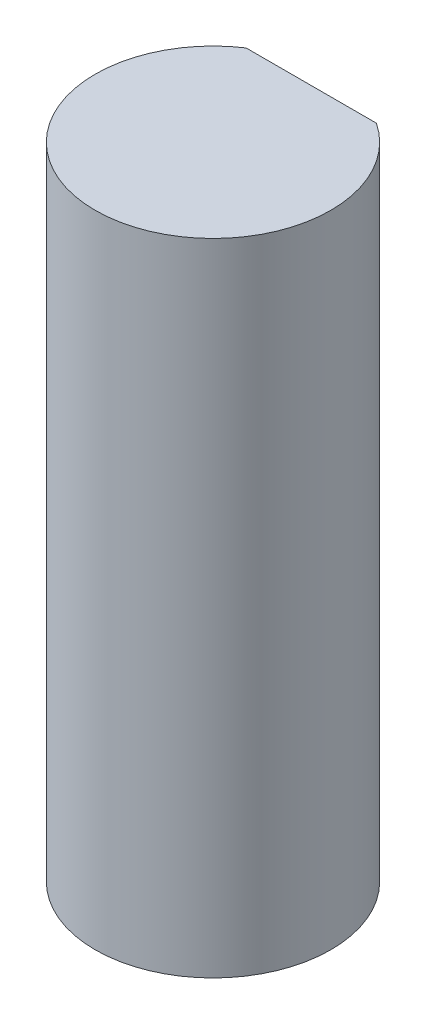
ISO-10303-21;
HEADER;
FILE_DESCRIPTION(('STEP AP214'),'2;1');
FILE_NAME('part.step','',(''),(''),'','','');
FILE_SCHEMA(('AUTOMOTIVE_DESIGN { 1 0 10303 214 1 1 1 1 }'));
ENDSEC;
DATA;
#1=APPLICATION_CONTEXT('core data for automotive mechanical design processes');
#2=APPLICATION_PROTOCOL_DEFINITION('international standard','automotive_design',2000,#1);
#3=PRODUCT_CONTEXT('',#1,'mechanical');
#4=PRODUCT('Part','Part','',(#3));
#5=PRODUCT_RELATED_PRODUCT_CATEGORY('part','',(#4));
#6=PRODUCT_DEFINITION_FORMATION('','',#4);
#7=PRODUCT_DEFINITION_CONTEXT('part definition',#1,'design');
#8=PRODUCT_DEFINITION('design','',#6,#7);
#9=PRODUCT_DEFINITION_SHAPE('','',#8);
#10=(LENGTH_UNIT() NAMED_UNIT(*) SI_UNIT(.MILLI.,.METRE.));
#11=(NAMED_UNIT(*) PLANE_ANGLE_UNIT() SI_UNIT($,.RADIAN.));
#12=(NAMED_UNIT(*) SI_UNIT($,.STERADIAN.) SOLID_ANGLE_UNIT());
#13=UNCERTAINTY_MEASURE_WITH_UNIT(LENGTH_MEASURE(1.E-05),#10,'distance_accuracy_value','');
#14=(GEOMETRIC_REPRESENTATION_CONTEXT(3) GLOBAL_UNCERTAINTY_ASSIGNED_CONTEXT((#13)) GLOBAL_UNIT_ASSIGNED_CONTEXT((#10,
#11,#12)) REPRESENTATION_CONTEXT('',''));
#15=CARTESIAN_POINT('',(0.,0.,0.));
#16=DIRECTION('',(0.,0.,1.));
#17=DIRECTION('',(1.,0.,0.));
#18=AXIS2_PLACEMENT_3D('',#15,#16,#17);
#19=CARTESIAN_POINT('',(0.,16.3,0.));
#20=DIRECTION('',(0.,-1.,0.));
#21=DIRECTION('',(0.,0.,-1.));
#22=AXIS2_PLACEMENT_3D('',#19,#20,#21);
#23=CYLINDRICAL_SURFACE('',#22,3.);
#24=CARTESIAN_POINT('',(0.,16.3,0.));
#25=DIRECTION('',(0.,1.,0.));
#26=DIRECTION('',(0.,0.,1.));
#27=AXIS2_PLACEMENT_3D('',#24,#25,#26);
#28=CIRCLE('',#27,3.);
#29=CARTESIAN_POINT('',(-1.6583123951777,16.3,-2.5));
#30=VERTEX_POINT('',#29);
#31=CARTESIAN_POINT('',(1.6583123951777,16.3,-2.5));
#32=VERTEX_POINT('',#31);
#33=EDGE_CURVE('E11',#30,#32,#28,.T.);
#34=ORIENTED_EDGE('',*,*,#33,.F.);
#35=DIRECTION('',(0.,1.,0.));
#36=VECTOR('',#35,1.);
#37=CARTESIAN_POINT('',(-1.6583123951777,4.3,-2.5));
#38=LINE('',#37,#36);
#39=CARTESIAN_POINT('',(-1.6583123951777,4.3,-2.5));
#40=VERTEX_POINT('',#39);
#41=EDGE_CURVE('E48',#40,#30,#38,.T.);
#42=ORIENTED_EDGE('',*,*,#41,.F.);
#43=CARTESIAN_POINT('',(0.,4.3,0.));
#44=DIRECTION('',(0.,1.,0.));
#45=DIRECTION('',(0.,0.,1.));
#46=AXIS2_PLACEMENT_3D('',#43,#44,#45);
#47=CIRCLE('',#46,3.);
#48=CARTESIAN_POINT('',(1.6583123951777,4.3,-2.5));
#49=VERTEX_POINT('',#48);
#50=EDGE_CURVE('E63',#49,#40,#47,.T.);
#51=ORIENTED_EDGE('',*,*,#50,.F.);
#52=DIRECTION('',(0.,1.,0.));
#53=VECTOR('',#52,1.);
#54=CARTESIAN_POINT('',(1.6583123951777,4.3,-2.5));
#55=LINE('',#54,#53);
#56=EDGE_CURVE('E54',#49,#32,#55,.T.);
#57=ORIENTED_EDGE('',*,*,#56,.T.);
#58=EDGE_LOOP('',(#34,#42,#51,#57));
#59=FACE_BOUND('',#58,.T.);
#60=CARTESIAN_POINT('',(0.,0.,0.));
#61=DIRECTION('',(0.,1.,0.));
#62=DIRECTION('',(0.,0.,1.));
#63=AXIS2_PLACEMENT_3D('',#60,#61,#62);
#64=CIRCLE('',#63,3.);
#65=CARTESIAN_POINT('',(0.,0.,3.));
#66=VERTEX_POINT('',#65);
#67=EDGE_CURVE('E37',#66,#66,#64,.T.);
#68=ORIENTED_EDGE('',*,*,#67,.T.);
#69=EDGE_LOOP('',(#68));
#70=FACE_BOUND('',#69,.T.);
#71=ADVANCED_FACE('F34',(#59,#70),#23,.T.);
#72=CARTESIAN_POINT('',(0.,16.3,0.));
#73=DIRECTION('',(0.,1.,0.));
#74=DIRECTION('',(0.,0.,1.));
#75=AXIS2_PLACEMENT_3D('',#72,#73,#74);
#76=PLANE('',#75);
#77=DIRECTION('',(1.,0.,0.));
#78=VECTOR('',#77,1.);
#79=CARTESIAN_POINT('',(-1.6583123951777,16.3,-2.5));
#80=LINE('',#79,#78);
#81=EDGE_CURVE('E59',#30,#32,#80,.T.);
#82=ORIENTED_EDGE('',*,*,#81,.F.);
#83=ORIENTED_EDGE('',*,*,#33,.T.);
#84=EDGE_LOOP('',(#82,#83));
#85=FACE_BOUND('',#84,.T.);
#86=ADVANCED_FACE('F69',(#85),#76,.T.);
#87=CARTESIAN_POINT('',(0.,0.,0.));
#88=DIRECTION('',(0.,1.,0.));
#89=DIRECTION('',(0.,0.,1.));
#90=AXIS2_PLACEMENT_3D('',#87,#88,#89);
#91=PLANE('',#90);
#92=ORIENTED_EDGE('',*,*,#67,.F.);
#93=EDGE_LOOP('',(#92));
#94=FACE_BOUND('',#93,.T.);
#95=ADVANCED_FACE('F71',(#94),#91,.F.);
#96=CARTESIAN_POINT('',(-1.6583123951777,4.3,-2.5));
#97=DIRECTION('',(0.,0.,1.));
#98=DIRECTION('',(1.,0.,0.));
#99=AXIS2_PLACEMENT_3D('',#96,#97,#98);
#100=PLANE('',#99);
#101=ORIENTED_EDGE('',*,*,#81,.T.);
#102=ORIENTED_EDGE('',*,*,#56,.F.);
#103=DIRECTION('',(1.,0.,0.));
#104=VECTOR('',#103,1.);
#105=CARTESIAN_POINT('',(-1.6583123951777,4.3,-2.5));
#106=LINE('',#105,#104);
#107=EDGE_CURVE('E86',#40,#49,#106,.T.);
#108=ORIENTED_EDGE('',*,*,#107,.F.);
#109=ORIENTED_EDGE('',*,*,#41,.T.);
#110=EDGE_LOOP('',(#101,#102,#108,#109));
#111=FACE_BOUND('',#110,.T.);
#112=ADVANCED_FACE('F60',(#111),#100,.F.);
#113=CARTESIAN_POINT('',(0.,4.3,0.));
#114=DIRECTION('',(0.,1.,0.));
#115=DIRECTION('',(0.,0.,1.));
#116=AXIS2_PLACEMENT_3D('',#113,#114,#115);
#117=PLANE('',#116);
#118=ORIENTED_EDGE('',*,*,#50,.T.);
#119=ORIENTED_EDGE('',*,*,#107,.T.);
#120=EDGE_LOOP('',(#118,#119));
#121=FACE_BOUND('',#120,.T.);
#122=ADVANCED_FACE('F81',(#121),#117,.T.);
#123=CLOSED_SHELL('',(#71,#86,#95,#112,#122));
#124=MANIFOLD_SOLID_BREP('B2',#123);
#125=ADVANCED_BREP_SHAPE_REPRESENTATION('',(#18,#124),#14);
#126=SHAPE_DEFINITION_REPRESENTATION(#9,#125);
ENDSEC;
END-ISO-10303-21;
